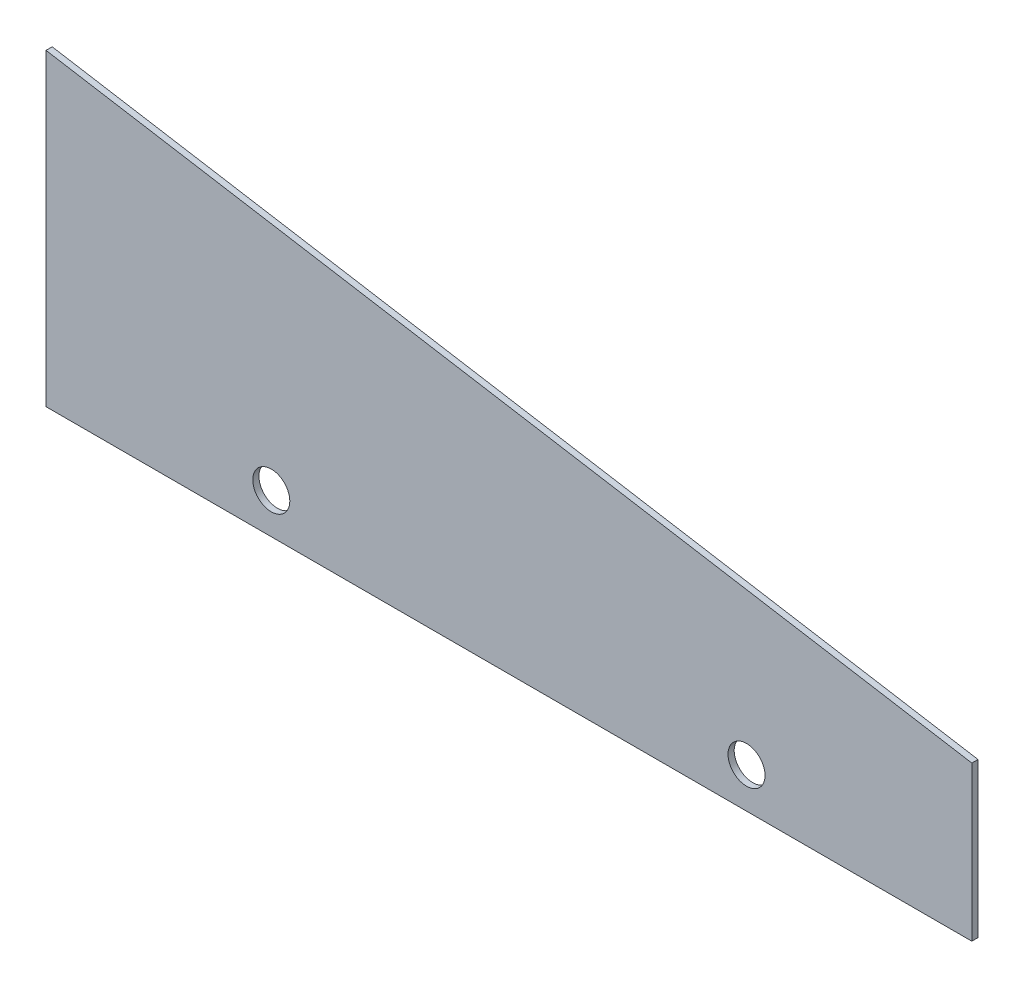
ISO-10303-21;
HEADER;
FILE_DESCRIPTION(('STEP AP214'),'2;1');
FILE_NAME('part.step','',(''),(''),'','','');
FILE_SCHEMA(('AUTOMOTIVE_DESIGN { 1 0 10303 214 1 1 1 1 }'));
ENDSEC;
DATA;
#1=APPLICATION_CONTEXT('core data for automotive mechanical design processes');
#2=APPLICATION_PROTOCOL_DEFINITION('international standard','automotive_design',2000,#1);
#3=PRODUCT_CONTEXT('',#1,'mechanical');
#4=PRODUCT('Part','Part','',(#3));
#5=PRODUCT_RELATED_PRODUCT_CATEGORY('part','',(#4));
#6=PRODUCT_DEFINITION_FORMATION('','',#4);
#7=PRODUCT_DEFINITION_CONTEXT('part definition',#1,'design');
#8=PRODUCT_DEFINITION('design','',#6,#7);
#9=PRODUCT_DEFINITION_SHAPE('','',#8);
#10=(LENGTH_UNIT() NAMED_UNIT(*) SI_UNIT(.MILLI.,.METRE.));
#11=(NAMED_UNIT(*) PLANE_ANGLE_UNIT() SI_UNIT($,.RADIAN.));
#12=(NAMED_UNIT(*) SI_UNIT($,.STERADIAN.) SOLID_ANGLE_UNIT());
#13=UNCERTAINTY_MEASURE_WITH_UNIT(LENGTH_MEASURE(1.E-05),#10,'distance_accuracy_value','');
#14=(GEOMETRIC_REPRESENTATION_CONTEXT(3) GLOBAL_UNCERTAINTY_ASSIGNED_CONTEXT((#13)) GLOBAL_UNIT_ASSIGNED_CONTEXT((#10,
#11,#12)) REPRESENTATION_CONTEXT('',''));
#15=CARTESIAN_POINT('',(0.,0.,0.));
#16=DIRECTION('',(0.,0.,1.));
#17=DIRECTION('',(1.,0.,0.));
#18=AXIS2_PLACEMENT_3D('',#15,#16,#17);
#19=CARTESIAN_POINT('',(150.,50.,2.));
#20=DIRECTION('',(-1.,0.,0.));
#21=DIRECTION('',(0.,0.,1.));
#22=AXIS2_PLACEMENT_3D('',#19,#20,#21);
#23=PLANE('',#22);
#24=DIRECTION('',(0.,1.,0.));
#25=VECTOR('',#24,1.);
#26=CARTESIAN_POINT('',(150.,50.,0.));
#27=LINE('',#26,#25);
#28=CARTESIAN_POINT('',(150.,0.,0.));
#29=VERTEX_POINT('',#28);
#30=CARTESIAN_POINT('',(150.,50.,0.));
#31=VERTEX_POINT('',#30);
#32=EDGE_CURVE('E113',#29,#31,#27,.T.);
#33=ORIENTED_EDGE('',*,*,#32,.T.);
#34=DIRECTION('',(0.,0.,-1.));
#35=VECTOR('',#34,1.);
#36=CARTESIAN_POINT('',(150.,50.,2.));
#37=LINE('',#36,#35);
#38=CARTESIAN_POINT('',(150.,50.,2.));
#39=VERTEX_POINT('',#38);
#40=EDGE_CURVE('E11',#39,#31,#37,.T.);
#41=ORIENTED_EDGE('',*,*,#40,.F.);
#42=DIRECTION('',(0.,1.,0.));
#43=VECTOR('',#42,1.);
#44=CARTESIAN_POINT('',(150.,50.,2.));
#45=LINE('',#44,#43);
#46=CARTESIAN_POINT('',(150.,0.,2.));
#47=VERTEX_POINT('',#46);
#48=EDGE_CURVE('E97',#47,#39,#45,.T.);
#49=ORIENTED_EDGE('',*,*,#48,.F.);
#50=DIRECTION('',(0.,0.,-1.));
#51=VECTOR('',#50,1.);
#52=CARTESIAN_POINT('',(150.,0.,2.));
#53=LINE('',#52,#51);
#54=EDGE_CURVE('E109',#47,#29,#53,.T.);
#55=ORIENTED_EDGE('',*,*,#54,.T.);
#56=EDGE_LOOP('',(#33,#41,#49,#55));
#57=FACE_BOUND('',#56,.T.);
#58=ADVANCED_FACE('F45',(#57),#23,.F.);
#59=CARTESIAN_POINT('',(-150.,100.,2.));
#60=DIRECTION('',(-0.164398987305357,-0.986393923832144,0.));
#61=DIRECTION('',(0.986393923832144,-0.164398987305357,0.));
#62=AXIS2_PLACEMENT_3D('',#59,#60,#61);
#63=PLANE('',#62);
#64=DIRECTION('',(-0.986393923832144,0.164398987305357,0.));
#65=VECTOR('',#64,1.);
#66=CARTESIAN_POINT('',(-150.,100.,0.));
#67=LINE('',#66,#65);
#68=CARTESIAN_POINT('',(-150.,100.,0.));
#69=VERTEX_POINT('',#68);
#70=EDGE_CURVE('E102',#31,#69,#67,.T.);
#71=ORIENTED_EDGE('',*,*,#70,.T.);
#72=DIRECTION('',(0.,0.,-1.));
#73=VECTOR('',#72,1.);
#74=CARTESIAN_POINT('',(-150.,100.,2.));
#75=LINE('',#74,#73);
#76=CARTESIAN_POINT('',(-150.,100.,2.));
#77=VERTEX_POINT('',#76);
#78=EDGE_CURVE('E54',#77,#69,#75,.T.);
#79=ORIENTED_EDGE('',*,*,#78,.F.);
#80=DIRECTION('',(-0.986393923832144,0.164398987305357,0.));
#81=VECTOR('',#80,1.);
#82=CARTESIAN_POINT('',(-150.,100.,2.));
#83=LINE('',#82,#81);
#84=EDGE_CURVE('E92',#39,#77,#83,.T.);
#85=ORIENTED_EDGE('',*,*,#84,.F.);
#86=ORIENTED_EDGE('',*,*,#40,.T.);
#87=EDGE_LOOP('',(#71,#79,#85,#86));
#88=FACE_BOUND('',#87,.T.);
#89=ADVANCED_FACE('F101',(#88),#63,.F.);
#90=CARTESIAN_POINT('',(-150.,0.,2.));
#91=DIRECTION('',(1.,0.,0.));
#92=DIRECTION('',(0.,1.,0.));
#93=AXIS2_PLACEMENT_3D('',#90,#91,#92);
#94=PLANE('',#93);
#95=DIRECTION('',(0.,-1.,0.));
#96=VECTOR('',#95,1.);
#97=CARTESIAN_POINT('',(-150.,0.,0.));
#98=LINE('',#97,#96);
#99=CARTESIAN_POINT('',(-150.,0.,0.));
#100=VERTEX_POINT('',#99);
#101=EDGE_CURVE('E79',#69,#100,#98,.T.);
#102=ORIENTED_EDGE('',*,*,#101,.T.);
#103=DIRECTION('',(0.,0.,-1.));
#104=VECTOR('',#103,1.);
#105=CARTESIAN_POINT('',(-150.,0.,2.));
#106=LINE('',#105,#104);
#107=CARTESIAN_POINT('',(-150.,0.,2.));
#108=VERTEX_POINT('',#107);
#109=EDGE_CURVE('E104',#108,#100,#106,.T.);
#110=ORIENTED_EDGE('',*,*,#109,.F.);
#111=DIRECTION('',(0.,-1.,0.));
#112=VECTOR('',#111,1.);
#113=CARTESIAN_POINT('',(-150.,0.,2.));
#114=LINE('',#113,#112);
#115=EDGE_CURVE('E95',#77,#108,#114,.T.);
#116=ORIENTED_EDGE('',*,*,#115,.F.);
#117=ORIENTED_EDGE('',*,*,#78,.T.);
#118=EDGE_LOOP('',(#102,#110,#116,#117));
#119=FACE_BOUND('',#118,.T.);
#120=ADVANCED_FACE('F105',(#119),#94,.F.);
#121=CARTESIAN_POINT('',(150.,0.,2.));
#122=DIRECTION('',(0.,1.,0.));
#123=DIRECTION('',(-1.,0.,0.));
#124=AXIS2_PLACEMENT_3D('',#121,#122,#123);
#125=PLANE('',#124);
#126=DIRECTION('',(1.,0.,0.));
#127=VECTOR('',#126,1.);
#128=CARTESIAN_POINT('',(150.,0.,0.));
#129=LINE('',#128,#127);
#130=EDGE_CURVE('E85',#100,#29,#129,.T.);
#131=ORIENTED_EDGE('',*,*,#130,.T.);
#132=ORIENTED_EDGE('',*,*,#54,.F.);
#133=DIRECTION('',(1.,0.,0.));
#134=VECTOR('',#133,1.);
#135=CARTESIAN_POINT('',(150.,0.,2.));
#136=LINE('',#135,#134);
#137=EDGE_CURVE('E62',#108,#47,#136,.T.);
#138=ORIENTED_EDGE('',*,*,#137,.F.);
#139=ORIENTED_EDGE('',*,*,#109,.T.);
#140=EDGE_LOOP('',(#131,#132,#138,#139));
#141=FACE_BOUND('',#140,.T.);
#142=ADVANCED_FACE('F127',(#141),#125,.F.);
#143=CARTESIAN_POINT('',(0.,0.,2.));
#144=DIRECTION('',(0.,0.,-1.));
#145=DIRECTION('',(-1.,0.,0.));
#146=AXIS2_PLACEMENT_3D('',#143,#144,#145);
#147=PLANE('',#146);
#148=CARTESIAN_POINT('',(-77.,13.,2.));
#149=DIRECTION('',(0.,0.,1.));
#150=DIRECTION('',(1.,0.,0.));
#151=AXIS2_PLACEMENT_3D('',#148,#149,#150);
#152=CIRCLE('',#151,6.);
#153=CARTESIAN_POINT('',(-71.,13.,2.));
#154=VERTEX_POINT('',#153);
#155=EDGE_CURVE('E142',#154,#154,#152,.T.);
#156=ORIENTED_EDGE('',*,*,#155,.F.);
#157=EDGE_LOOP('',(#156));
#158=FACE_BOUND('',#157,.T.);
#159=CARTESIAN_POINT('',(77.,13.,2.));
#160=DIRECTION('',(0.,0.,1.));
#161=DIRECTION('',(1.,0.,0.));
#162=AXIS2_PLACEMENT_3D('',#159,#160,#161);
#163=CIRCLE('',#162,6.00000000000002);
#164=CARTESIAN_POINT('',(83.,13.,2.));
#165=VERTEX_POINT('',#164);
#166=EDGE_CURVE('E138',#165,#165,#163,.T.);
#167=ORIENTED_EDGE('',*,*,#166,.F.);
#168=EDGE_LOOP('',(#167));
#169=FACE_BOUND('',#168,.T.);
#170=ORIENTED_EDGE('',*,*,#48,.T.);
#171=ORIENTED_EDGE('',*,*,#84,.T.);
#172=ORIENTED_EDGE('',*,*,#115,.T.);
#173=ORIENTED_EDGE('',*,*,#137,.T.);
#174=EDGE_LOOP('',(#170,#171,#172,#173));
#175=FACE_BOUND('',#174,.T.);
#176=ADVANCED_FACE('F93',(#158,#169,#175),#147,.F.);
#177=CARTESIAN_POINT('',(0.,0.,0.));
#178=DIRECTION('',(0.,0.,-1.));
#179=DIRECTION('',(-1.,0.,0.));
#180=AXIS2_PLACEMENT_3D('',#177,#178,#179);
#181=PLANE('',#180);
#182=CARTESIAN_POINT('',(-77.,13.,0.));
#183=DIRECTION('',(0.,0.,1.));
#184=DIRECTION('',(1.,0.,0.));
#185=AXIS2_PLACEMENT_3D('',#182,#183,#184);
#186=CIRCLE('',#185,6.);
#187=CARTESIAN_POINT('',(-71.,13.,0.));
#188=VERTEX_POINT('',#187);
#189=EDGE_CURVE('E117',#188,#188,#186,.T.);
#190=ORIENTED_EDGE('',*,*,#189,.T.);
#191=EDGE_LOOP('',(#190));
#192=FACE_BOUND('',#191,.T.);
#193=CARTESIAN_POINT('',(77.,13.,0.));
#194=DIRECTION('',(0.,0.,1.));
#195=DIRECTION('',(1.,0.,0.));
#196=AXIS2_PLACEMENT_3D('',#193,#194,#195);
#197=CIRCLE('',#196,6.00000000000002);
#198=CARTESIAN_POINT('',(83.,13.,0.));
#199=VERTEX_POINT('',#198);
#200=EDGE_CURVE('E134',#199,#199,#197,.T.);
#201=ORIENTED_EDGE('',*,*,#200,.T.);
#202=EDGE_LOOP('',(#201));
#203=FACE_BOUND('',#202,.T.);
#204=ORIENTED_EDGE('',*,*,#32,.F.);
#205=ORIENTED_EDGE('',*,*,#130,.F.);
#206=ORIENTED_EDGE('',*,*,#101,.F.);
#207=ORIENTED_EDGE('',*,*,#70,.F.);
#208=EDGE_LOOP('',(#204,#205,#206,#207));
#209=FACE_BOUND('',#208,.T.);
#210=ADVANCED_FACE('F130',(#192,#203,#209),#181,.T.);
#211=CARTESIAN_POINT('',(77.,13.,0.));
#212=DIRECTION('',(0.,0.,1.));
#213=DIRECTION('',(1.,0.,0.));
#214=AXIS2_PLACEMENT_3D('',#211,#212,#213);
#215=CYLINDRICAL_SURFACE('',#214,6.00000000000002);
#216=ORIENTED_EDGE('',*,*,#200,.F.);
#217=EDGE_LOOP('',(#216));
#218=FACE_BOUND('',#217,.T.);
#219=ORIENTED_EDGE('',*,*,#166,.T.);
#220=EDGE_LOOP('',(#219));
#221=FACE_BOUND('',#220,.T.);
#222=ADVANCED_FACE('F155',(#218,#221),#215,.F.);
#223=CARTESIAN_POINT('',(-77.,13.,0.));
#224=DIRECTION('',(0.,0.,1.));
#225=DIRECTION('',(1.,0.,0.));
#226=AXIS2_PLACEMENT_3D('',#223,#224,#225);
#227=CYLINDRICAL_SURFACE('',#226,6.);
#228=ORIENTED_EDGE('',*,*,#189,.F.);
#229=EDGE_LOOP('',(#228));
#230=FACE_BOUND('',#229,.T.);
#231=ORIENTED_EDGE('',*,*,#155,.T.);
#232=EDGE_LOOP('',(#231));
#233=FACE_BOUND('',#232,.T.);
#234=ADVANCED_FACE('F152',(#230,#233),#227,.F.);
#235=CLOSED_SHELL('',(#58,#89,#120,#142,#176,#210,#222,#234));
#236=MANIFOLD_SOLID_BREP('B2',#235);
#237=ADVANCED_BREP_SHAPE_REPRESENTATION('',(#18,#236),#14);
#238=SHAPE_DEFINITION_REPRESENTATION(#9,#237);
ENDSEC;
END-ISO-10303-21;
